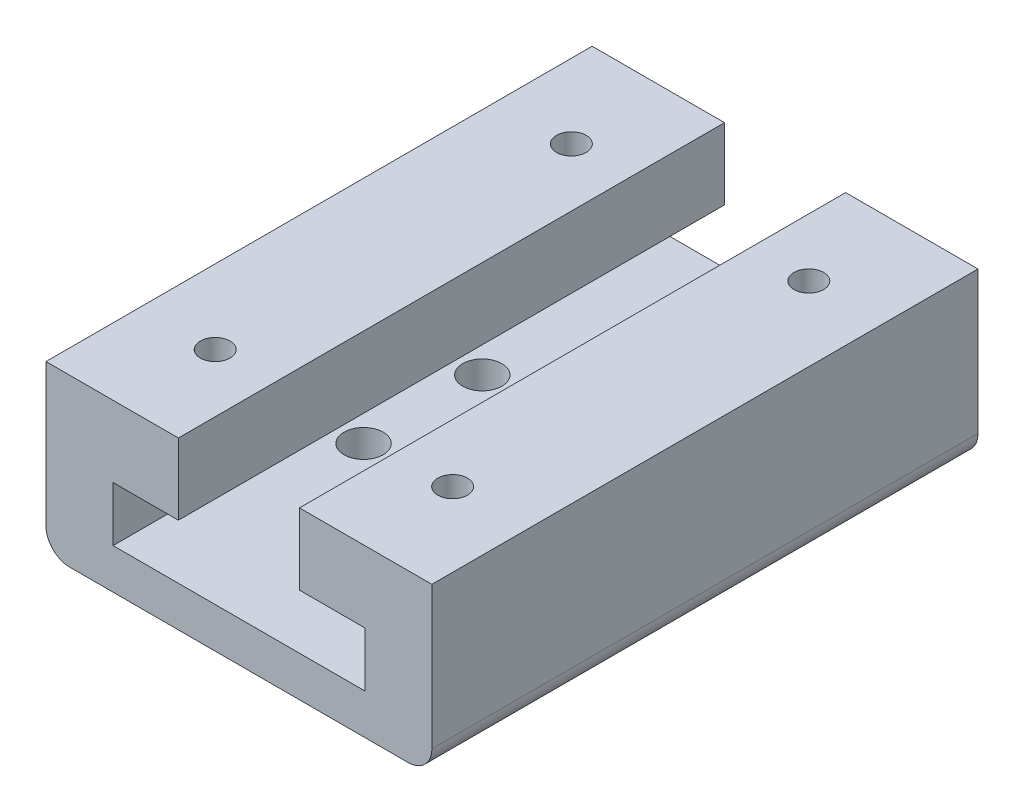
ISO-10303-21;
HEADER;
FILE_DESCRIPTION(('STEP AP214'),'2;1');
FILE_NAME('part.step','',(''),(''),'','','');
FILE_SCHEMA(('AUTOMOTIVE_DESIGN { 1 0 10303 214 1 1 1 1 }'));
ENDSEC;
DATA;
#1=APPLICATION_CONTEXT('core data for automotive mechanical design processes');
#2=APPLICATION_PROTOCOL_DEFINITION('international standard','automotive_design',2000,#1);
#3=PRODUCT_CONTEXT('',#1,'mechanical');
#4=PRODUCT('Part','Part','',(#3));
#5=PRODUCT_RELATED_PRODUCT_CATEGORY('part','',(#4));
#6=PRODUCT_DEFINITION_FORMATION('','',#4);
#7=PRODUCT_DEFINITION_CONTEXT('part definition',#1,'design');
#8=PRODUCT_DEFINITION('design','',#6,#7);
#9=PRODUCT_DEFINITION_SHAPE('','',#8);
#10=(LENGTH_UNIT() NAMED_UNIT(*) SI_UNIT(.MILLI.,.METRE.));
#11=(NAMED_UNIT(*) PLANE_ANGLE_UNIT() SI_UNIT($,.RADIAN.));
#12=(NAMED_UNIT(*) SI_UNIT($,.STERADIAN.) SOLID_ANGLE_UNIT());
#13=UNCERTAINTY_MEASURE_WITH_UNIT(LENGTH_MEASURE(1.E-05),#10,'distance_accuracy_value','');
#14=(GEOMETRIC_REPRESENTATION_CONTEXT(3) GLOBAL_UNCERTAINTY_ASSIGNED_CONTEXT((#13)) GLOBAL_UNIT_ASSIGNED_CONTEXT((#10,
#11,#12)) REPRESENTATION_CONTEXT('',''));
#15=CARTESIAN_POINT('',(0.,0.,0.));
#16=DIRECTION('',(0.,0.,1.));
#17=DIRECTION('',(1.,0.,0.));
#18=AXIS2_PLACEMENT_3D('',#15,#16,#17);
#19=CARTESIAN_POINT('',(16.25,14.,23.));
#20=DIRECTION('',(0.,0.,-1.));
#21=DIRECTION('',(-1.,0.,0.));
#22=AXIS2_PLACEMENT_3D('',#19,#20,#21);
#23=PLANE('',#22);
#24=DIRECTION('',(1.,0.,0.));
#25=VECTOR('',#24,1.);
#26=CARTESIAN_POINT('',(16.25,0.,23.));
#27=LINE('',#26,#25);
#28=CARTESIAN_POINT('',(-14.25,0.,23.));
#29=VERTEX_POINT('',#28);
#30=CARTESIAN_POINT('',(14.25,0.,23.));
#31=VERTEX_POINT('',#30);
#32=EDGE_CURVE('E198',#29,#31,#27,.T.);
#33=ORIENTED_EDGE('',*,*,#32,.T.);
#34=CARTESIAN_POINT('',(14.25,2.,23.));
#35=DIRECTION('',(0.,0.,-1.));
#36=DIRECTION('',(-1.,0.,0.));
#37=AXIS2_PLACEMENT_3D('',#34,#35,#36);
#38=CIRCLE('',#37,2.);
#39=CARTESIAN_POINT('',(16.25,2.,23.));
#40=VERTEX_POINT('',#39);
#41=EDGE_CURVE('E47',#31,#40,#38,.F.);
#42=ORIENTED_EDGE('',*,*,#41,.T.);
#43=DIRECTION('',(0.,-1.,0.));
#44=VECTOR('',#43,1.);
#45=CARTESIAN_POINT('',(16.25,14.,23.));
#46=LINE('',#45,#44);
#47=CARTESIAN_POINT('',(16.25,14.,23.));
#48=VERTEX_POINT('',#47);
#49=EDGE_CURVE('E233',#48,#40,#46,.T.);
#50=ORIENTED_EDGE('',*,*,#49,.F.);
#51=DIRECTION('',(1.,0.,0.));
#52=VECTOR('',#51,1.);
#53=CARTESIAN_POINT('',(16.25,14.,23.));
#54=LINE('',#53,#52);
#55=CARTESIAN_POINT('',(5.10000000000001,14.,23.));
#56=VERTEX_POINT('',#55);
#57=EDGE_CURVE('E166',#56,#48,#54,.T.);
#58=ORIENTED_EDGE('',*,*,#57,.F.);
#59=DIRECTION('',(0.,1.,0.));
#60=VECTOR('',#59,1.);
#61=CARTESIAN_POINT('',(5.10000000000001,0.,23.));
#62=LINE('',#61,#60);
#63=CARTESIAN_POINT('',(5.10000000000001,8.,23.));
#64=VERTEX_POINT('',#63);
#65=EDGE_CURVE('E153',#64,#56,#62,.T.);
#66=ORIENTED_EDGE('',*,*,#65,.F.);
#67=DIRECTION('',(-1.,0.,0.));
#68=VECTOR('',#67,1.);
#69=CARTESIAN_POINT('',(0.,8.,23.));
#70=LINE('',#69,#68);
#71=CARTESIAN_POINT('',(10.6,8.,23.));
#72=VERTEX_POINT('',#71);
#73=EDGE_CURVE('E142',#72,#64,#70,.T.);
#74=ORIENTED_EDGE('',*,*,#73,.F.);
#75=DIRECTION('',(0.,1.,0.));
#76=VECTOR('',#75,1.);
#77=CARTESIAN_POINT('',(10.6,0.,23.));
#78=LINE('',#77,#76);
#79=CARTESIAN_POINT('',(10.6,3.4,23.));
#80=VERTEX_POINT('',#79);
#81=EDGE_CURVE('E152',#80,#72,#78,.T.);
#82=ORIENTED_EDGE('',*,*,#81,.F.);
#83=DIRECTION('',(-1.,0.,0.));
#84=VECTOR('',#83,1.);
#85=CARTESIAN_POINT('',(0.,3.4,23.));
#86=LINE('',#85,#84);
#87=CARTESIAN_POINT('',(-10.6,3.4,23.));
#88=VERTEX_POINT('',#87);
#89=EDGE_CURVE('E176',#80,#88,#86,.T.);
#90=ORIENTED_EDGE('',*,*,#89,.T.);
#91=DIRECTION('',(0.,1.,0.));
#92=VECTOR('',#91,1.);
#93=CARTESIAN_POINT('',(-10.6,0.,23.));
#94=LINE('',#93,#92);
#95=CARTESIAN_POINT('',(-10.6,8.,23.));
#96=VERTEX_POINT('',#95);
#97=EDGE_CURVE('E179',#88,#96,#94,.T.);
#98=ORIENTED_EDGE('',*,*,#97,.T.);
#99=CARTESIAN_POINT('',(-5.09999999999999,8.,23.));
#100=VERTEX_POINT('',#99);
#101=EDGE_CURVE('E155',#100,#96,#70,.T.);
#102=ORIENTED_EDGE('',*,*,#101,.F.);
#103=DIRECTION('',(0.,1.,0.));
#104=VECTOR('',#103,1.);
#105=CARTESIAN_POINT('',(-5.09999999999999,0.,23.));
#106=LINE('',#105,#104);
#107=CARTESIAN_POINT('',(-5.09999999999999,14.,23.));
#108=VERTEX_POINT('',#107);
#109=EDGE_CURVE('E162',#100,#108,#106,.T.);
#110=ORIENTED_EDGE('',*,*,#109,.T.);
#111=CARTESIAN_POINT('',(-16.25,14.,23.));
#112=VERTEX_POINT('',#111);
#113=EDGE_CURVE('E215',#112,#108,#54,.T.);
#114=ORIENTED_EDGE('',*,*,#113,.F.);
#115=DIRECTION('',(0.,-1.,0.));
#116=VECTOR('',#115,1.);
#117=CARTESIAN_POINT('',(-16.25,14.,23.));
#118=LINE('',#117,#116);
#119=CARTESIAN_POINT('',(-16.25,2.,23.));
#120=VERTEX_POINT('',#119);
#121=EDGE_CURVE('E236',#112,#120,#118,.T.);
#122=ORIENTED_EDGE('',*,*,#121,.T.);
#123=CARTESIAN_POINT('',(-14.25,2.,23.));
#124=DIRECTION('',(0.,0.,-1.));
#125=DIRECTION('',(-1.,0.,0.));
#126=AXIS2_PLACEMENT_3D('',#123,#124,#125);
#127=CIRCLE('',#126,2.);
#128=EDGE_CURVE('E54',#120,#29,#127,.F.);
#129=ORIENTED_EDGE('',*,*,#128,.T.);
#130=EDGE_LOOP('',(#33,#42,#50,#58,#66,#74,#82,#90,#98,#102,#110,#114,#122,#129));
#131=FACE_BOUND('',#130,.T.);
#132=ADVANCED_FACE('F39',(#131),#23,.F.);
#133=CARTESIAN_POINT('',(16.25,14.,-23.));
#134=DIRECTION('',(0.,0.,1.));
#135=DIRECTION('',(1.,0.,0.));
#136=AXIS2_PLACEMENT_3D('',#133,#134,#135);
#137=PLANE('',#136);
#138=DIRECTION('',(0.,-1.,0.));
#139=VECTOR('',#138,1.);
#140=CARTESIAN_POINT('',(16.25,14.,-23.));
#141=LINE('',#140,#139);
#142=CARTESIAN_POINT('',(16.25,14.,-23.));
#143=VERTEX_POINT('',#142);
#144=CARTESIAN_POINT('',(16.25,2.,-23.));
#145=VERTEX_POINT('',#144);
#146=EDGE_CURVE('E230',#143,#145,#141,.T.);
#147=ORIENTED_EDGE('',*,*,#146,.T.);
#148=CARTESIAN_POINT('',(14.25,2.,-23.));
#149=DIRECTION('',(0.,0.,1.));
#150=DIRECTION('',(1.,0.,0.));
#151=AXIS2_PLACEMENT_3D('',#148,#149,#150);
#152=CIRCLE('',#151,2.);
#153=CARTESIAN_POINT('',(14.25,0.,-23.));
#154=VERTEX_POINT('',#153);
#155=EDGE_CURVE('E244',#145,#154,#152,.F.);
#156=ORIENTED_EDGE('',*,*,#155,.T.);
#157=DIRECTION('',(-1.,0.,0.));
#158=VECTOR('',#157,1.);
#159=CARTESIAN_POINT('',(16.25,0.,-23.));
#160=LINE('',#159,#158);
#161=CARTESIAN_POINT('',(-14.25,0.,-23.));
#162=VERTEX_POINT('',#161);
#163=EDGE_CURVE('E214',#154,#162,#160,.T.);
#164=ORIENTED_EDGE('',*,*,#163,.T.);
#165=CARTESIAN_POINT('',(-14.25,2.,-23.));
#166=DIRECTION('',(0.,0.,1.));
#167=DIRECTION('',(1.,0.,0.));
#168=AXIS2_PLACEMENT_3D('',#165,#166,#167);
#169=CIRCLE('',#168,2.);
#170=CARTESIAN_POINT('',(-16.25,2.,-23.));
#171=VERTEX_POINT('',#170);
#172=EDGE_CURVE('E242',#162,#171,#169,.F.);
#173=ORIENTED_EDGE('',*,*,#172,.T.);
#174=DIRECTION('',(0.,-1.,0.));
#175=VECTOR('',#174,1.);
#176=CARTESIAN_POINT('',(-16.25,14.,-23.));
#177=LINE('',#176,#175);
#178=CARTESIAN_POINT('',(-16.25,14.,-23.));
#179=VERTEX_POINT('',#178);
#180=EDGE_CURVE('E224',#179,#171,#177,.T.);
#181=ORIENTED_EDGE('',*,*,#180,.F.);
#182=DIRECTION('',(-1.,0.,0.));
#183=VECTOR('',#182,1.);
#184=CARTESIAN_POINT('',(16.25,14.,-23.));
#185=LINE('',#184,#183);
#186=CARTESIAN_POINT('',(-5.1,14.,-23.));
#187=VERTEX_POINT('',#186);
#188=EDGE_CURVE('E220',#187,#179,#185,.T.);
#189=ORIENTED_EDGE('',*,*,#188,.F.);
#190=DIRECTION('',(0.,1.,0.));
#191=VECTOR('',#190,1.);
#192=CARTESIAN_POINT('',(-5.1,0.,-23.));
#193=LINE('',#192,#191);
#194=CARTESIAN_POINT('',(-5.1,8.,-23.));
#195=VERTEX_POINT('',#194);
#196=EDGE_CURVE('E167',#195,#187,#193,.T.);
#197=ORIENTED_EDGE('',*,*,#196,.F.);
#198=DIRECTION('',(-1.,0.,0.));
#199=VECTOR('',#198,1.);
#200=CARTESIAN_POINT('',(0.,8.,-23.));
#201=LINE('',#200,#199);
#202=CARTESIAN_POINT('',(-10.6,8.,-23.));
#203=VERTEX_POINT('',#202);
#204=EDGE_CURVE('E169',#195,#203,#201,.T.);
#205=ORIENTED_EDGE('',*,*,#204,.T.);
#206=DIRECTION('',(0.,1.,0.));
#207=VECTOR('',#206,1.);
#208=CARTESIAN_POINT('',(-10.6,0.,-23.));
#209=LINE('',#208,#207);
#210=CARTESIAN_POINT('',(-10.6,3.4,-23.));
#211=VERTEX_POINT('',#210);
#212=EDGE_CURVE('E193',#211,#203,#209,.T.);
#213=ORIENTED_EDGE('',*,*,#212,.F.);
#214=DIRECTION('',(-1.,0.,0.));
#215=VECTOR('',#214,1.);
#216=CARTESIAN_POINT('',(0.,3.4,-23.));
#217=LINE('',#216,#215);
#218=CARTESIAN_POINT('',(10.6,3.4,-23.));
#219=VERTEX_POINT('',#218);
#220=EDGE_CURVE('E190',#219,#211,#217,.T.);
#221=ORIENTED_EDGE('',*,*,#220,.F.);
#222=DIRECTION('',(0.,1.,0.));
#223=VECTOR('',#222,1.);
#224=CARTESIAN_POINT('',(10.6,0.,-23.));
#225=LINE('',#224,#223);
#226=CARTESIAN_POINT('',(10.6,8.,-23.));
#227=VERTEX_POINT('',#226);
#228=EDGE_CURVE('E187',#219,#227,#225,.T.);
#229=ORIENTED_EDGE('',*,*,#228,.T.);
#230=CARTESIAN_POINT('',(5.1,8.,-23.));
#231=VERTEX_POINT('',#230);
#232=EDGE_CURVE('E185',#227,#231,#201,.T.);
#233=ORIENTED_EDGE('',*,*,#232,.T.);
#234=DIRECTION('',(0.,1.,0.));
#235=VECTOR('',#234,1.);
#236=CARTESIAN_POINT('',(5.1,0.,-23.));
#237=LINE('',#236,#235);
#238=CARTESIAN_POINT('',(5.1,14.,-23.));
#239=VERTEX_POINT('',#238);
#240=EDGE_CURVE('E160',#231,#239,#237,.T.);
#241=ORIENTED_EDGE('',*,*,#240,.T.);
#242=EDGE_CURVE('E221',#143,#239,#185,.T.);
#243=ORIENTED_EDGE('',*,*,#242,.F.);
#244=EDGE_LOOP('',(#147,#156,#164,#173,#181,#189,#197,#205,#213,#221,#229,#233,#241,#243));
#245=FACE_BOUND('',#244,.T.);
#246=ADVANCED_FACE('F258',(#245),#137,.F.);
#247=CARTESIAN_POINT('',(0.,14.,0.));
#248=DIRECTION('',(0.,1.,0.));
#249=DIRECTION('',(0.,0.,1.));
#250=AXIS2_PLACEMENT_3D('',#247,#248,#249);
#251=PLANE('',#250);
#252=CARTESIAN_POINT('',(10.,14.,15.));
#253=DIRECTION('',(0.,1.,0.));
#254=DIRECTION('',(0.,0.,1.));
#255=AXIS2_PLACEMENT_3D('',#252,#253,#254);
#256=CIRCLE('',#255,1.25);
#257=CARTESIAN_POINT('',(10.,14.,16.25));
#258=VERTEX_POINT('',#257);
#259=EDGE_CURVE('E426',#258,#258,#256,.T.);
#260=ORIENTED_EDGE('',*,*,#259,.F.);
#261=EDGE_LOOP('',(#260));
#262=FACE_BOUND('',#261,.T.);
#263=CARTESIAN_POINT('',(10.,14.,-15.));
#264=DIRECTION('',(0.,1.,0.));
#265=DIRECTION('',(0.,0.,1.));
#266=AXIS2_PLACEMENT_3D('',#263,#264,#265);
#267=CIRCLE('',#266,1.25);
#268=CARTESIAN_POINT('',(10.,14.,-13.75));
#269=VERTEX_POINT('',#268);
#270=EDGE_CURVE('E415',#269,#269,#267,.T.);
#271=ORIENTED_EDGE('',*,*,#270,.F.);
#272=EDGE_LOOP('',(#271));
#273=FACE_BOUND('',#272,.T.);
#274=ORIENTED_EDGE('',*,*,#242,.T.);
#275=DIRECTION('',(0.,0.,-1.));
#276=VECTOR('',#275,1.);
#277=CARTESIAN_POINT('',(5.10000000000001,14.,23.));
#278=LINE('',#277,#276);
#279=EDGE_CURVE('E196',#56,#239,#278,.T.);
#280=ORIENTED_EDGE('',*,*,#279,.F.);
#281=ORIENTED_EDGE('',*,*,#57,.T.);
#282=DIRECTION('',(0.,0.,-1.));
#283=VECTOR('',#282,1.);
#284=CARTESIAN_POINT('',(16.25,14.,23.));
#285=LINE('',#284,#283);
#286=EDGE_CURVE('E218',#48,#143,#285,.T.);
#287=ORIENTED_EDGE('',*,*,#286,.T.);
#288=EDGE_LOOP('',(#274,#280,#281,#287));
#289=FACE_BOUND('',#288,.T.);
#290=ADVANCED_FACE('F292',(#262,#273,#289),#251,.T.);
#291=CARTESIAN_POINT('',(-16.25,14.,23.));
#292=DIRECTION('',(1.,0.,0.));
#293=DIRECTION('',(0.,0.,-1.));
#294=AXIS2_PLACEMENT_3D('',#291,#292,#293);
#295=PLANE('',#294);
#296=ORIENTED_EDGE('',*,*,#180,.T.);
#297=DIRECTION('',(0.,0.,1.));
#298=VECTOR('',#297,1.);
#299=CARTESIAN_POINT('',(-16.25,2.,23.));
#300=LINE('',#299,#298);
#301=EDGE_CURVE('E11',#171,#120,#300,.T.);
#302=ORIENTED_EDGE('',*,*,#301,.T.);
#303=ORIENTED_EDGE('',*,*,#121,.F.);
#304=DIRECTION('',(0.,0.,1.));
#305=VECTOR('',#304,1.);
#306=CARTESIAN_POINT('',(-16.25,14.,23.));
#307=LINE('',#306,#305);
#308=EDGE_CURVE('E211',#179,#112,#307,.T.);
#309=ORIENTED_EDGE('',*,*,#308,.F.);
#310=EDGE_LOOP('',(#296,#302,#303,#309));
#311=FACE_BOUND('',#310,.T.);
#312=ADVANCED_FACE('F266',(#311),#295,.F.);
#313=CARTESIAN_POINT('',(16.25,14.,23.));
#314=DIRECTION('',(-1.,0.,0.));
#315=DIRECTION('',(0.,0.,1.));
#316=AXIS2_PLACEMENT_3D('',#313,#314,#315);
#317=PLANE('',#316);
#318=ORIENTED_EDGE('',*,*,#49,.T.);
#319=DIRECTION('',(0.,0.,-1.));
#320=VECTOR('',#319,1.);
#321=CARTESIAN_POINT('',(16.25,2.,23.));
#322=LINE('',#321,#320);
#323=EDGE_CURVE('E239',#40,#145,#322,.T.);
#324=ORIENTED_EDGE('',*,*,#323,.T.);
#325=ORIENTED_EDGE('',*,*,#146,.F.);
#326=ORIENTED_EDGE('',*,*,#286,.F.);
#327=EDGE_LOOP('',(#318,#324,#325,#326));
#328=FACE_BOUND('',#327,.T.);
#329=ADVANCED_FACE('F254',(#328),#317,.F.);
#330=CARTESIAN_POINT('',(-10.,14.,15.));
#331=DIRECTION('',(0.,1.,0.));
#332=DIRECTION('',(0.,0.,1.));
#333=AXIS2_PLACEMENT_3D('',#330,#331,#332);
#334=CIRCLE('',#333,1.25);
#335=CARTESIAN_POINT('',(-10.,14.,16.25));
#336=VERTEX_POINT('',#335);
#337=EDGE_CURVE('E421',#336,#336,#334,.T.);
#338=ORIENTED_EDGE('',*,*,#337,.F.);
#339=EDGE_LOOP('',(#338));
#340=FACE_BOUND('',#339,.T.);
#341=CARTESIAN_POINT('',(-10.,14.,-15.));
#342=DIRECTION('',(0.,1.,0.));
#343=DIRECTION('',(0.,0.,1.));
#344=AXIS2_PLACEMENT_3D('',#341,#342,#343);
#345=CIRCLE('',#344,1.25);
#346=CARTESIAN_POINT('',(-10.,14.,-13.75));
#347=VERTEX_POINT('',#346);
#348=EDGE_CURVE('E412',#347,#347,#345,.T.);
#349=ORIENTED_EDGE('',*,*,#348,.F.);
#350=EDGE_LOOP('',(#349));
#351=FACE_BOUND('',#350,.T.);
#352=DIRECTION('',(0.,0.,-1.));
#353=VECTOR('',#352,1.);
#354=CARTESIAN_POINT('',(-5.09999999999999,14.,23.));
#355=LINE('',#354,#353);
#356=EDGE_CURVE('E199',#108,#187,#355,.T.);
#357=ORIENTED_EDGE('',*,*,#356,.T.);
#358=ORIENTED_EDGE('',*,*,#188,.T.);
#359=ORIENTED_EDGE('',*,*,#308,.T.);
#360=ORIENTED_EDGE('',*,*,#113,.T.);
#361=EDGE_LOOP('',(#357,#358,#359,#360));
#362=FACE_BOUND('',#361,.T.);
#363=ADVANCED_FACE('F269',(#340,#351,#362),#251,.T.);
#364=CARTESIAN_POINT('',(0.,0.,0.));
#365=DIRECTION('',(0.,1.,0.));
#366=DIRECTION('',(0.,0.,1.));
#367=AXIS2_PLACEMENT_3D('',#364,#365,#366);
#368=PLANE('',#367);
#369=CARTESIAN_POINT('',(-7.5,0.,-5.));
#370=DIRECTION('',(0.,-1.,0.));
#371=DIRECTION('',(0.,0.,-1.));
#372=AXIS2_PLACEMENT_3D('',#369,#370,#371);
#373=CIRCLE('',#372,1.65);
#374=CARTESIAN_POINT('',(-7.5,0.,-6.65));
#375=VERTEX_POINT('',#374);
#376=EDGE_CURVE('E385',#375,#375,#373,.T.);
#377=ORIENTED_EDGE('',*,*,#376,.F.);
#378=EDGE_LOOP('',(#377));
#379=FACE_BOUND('',#378,.T.);
#380=CARTESIAN_POINT('',(7.5,0.,-5.));
#381=DIRECTION('',(0.,-1.,0.));
#382=DIRECTION('',(0.,0.,-1.));
#383=AXIS2_PLACEMENT_3D('',#380,#381,#382);
#384=CIRCLE('',#383,1.65);
#385=CARTESIAN_POINT('',(7.5,0.,-6.65));
#386=VERTEX_POINT('',#385);
#387=EDGE_CURVE('E389',#386,#386,#384,.T.);
#388=ORIENTED_EDGE('',*,*,#387,.F.);
#389=EDGE_LOOP('',(#388));
#390=FACE_BOUND('',#389,.T.);
#391=CARTESIAN_POINT('',(7.5,0.,5.));
#392=DIRECTION('',(0.,-1.,0.));
#393=DIRECTION('',(0.,0.,-1.));
#394=AXIS2_PLACEMENT_3D('',#391,#392,#393);
#395=CIRCLE('',#394,1.65);
#396=CARTESIAN_POINT('',(7.5,0.,3.35));
#397=VERTEX_POINT('',#396);
#398=EDGE_CURVE('E393',#397,#397,#395,.T.);
#399=ORIENTED_EDGE('',*,*,#398,.F.);
#400=EDGE_LOOP('',(#399));
#401=FACE_BOUND('',#400,.T.);
#402=CARTESIAN_POINT('',(-7.5,0.,5.));
#403=DIRECTION('',(0.,-1.,0.));
#404=DIRECTION('',(0.,0.,-1.));
#405=AXIS2_PLACEMENT_3D('',#402,#403,#404);
#406=CIRCLE('',#405,1.65);
#407=CARTESIAN_POINT('',(-7.5,0.,3.35));
#408=VERTEX_POINT('',#407);
#409=EDGE_CURVE('E396',#408,#408,#406,.T.);
#410=ORIENTED_EDGE('',*,*,#409,.F.);
#411=EDGE_LOOP('',(#410));
#412=FACE_BOUND('',#411,.T.);
#413=ORIENTED_EDGE('',*,*,#163,.F.);
#414=DIRECTION('',(0.,0.,-1.));
#415=VECTOR('',#414,1.);
#416=CARTESIAN_POINT('',(14.25,0.,0.));
#417=LINE('',#416,#415);
#418=EDGE_CURVE('E61',#154,#31,#417,.F.);
#419=ORIENTED_EDGE('',*,*,#418,.T.);
#420=ORIENTED_EDGE('',*,*,#32,.F.);
#421=DIRECTION('',(0.,0.,1.));
#422=VECTOR('',#421,1.);
#423=CARTESIAN_POINT('',(-14.25,0.,0.));
#424=LINE('',#423,#422);
#425=EDGE_CURVE('E246',#29,#162,#424,.F.);
#426=ORIENTED_EDGE('',*,*,#425,.T.);
#427=EDGE_LOOP('',(#413,#419,#420,#426));
#428=FACE_BOUND('',#427,.T.);
#429=ADVANCED_FACE('F261',(#379,#390,#401,#412,#428),#368,.F.);
#430=CARTESIAN_POINT('',(5.10000000000001,0.,23.));
#431=DIRECTION('',(-1.,0.,0.));
#432=DIRECTION('',(0.,0.,1.));
#433=AXIS2_PLACEMENT_3D('',#430,#431,#432);
#434=PLANE('',#433);
#435=ORIENTED_EDGE('',*,*,#240,.F.);
#436=DIRECTION('',(0.,0.,-1.));
#437=VECTOR('',#436,1.);
#438=CARTESIAN_POINT('',(5.10000000000001,8.,23.));
#439=LINE('',#438,#437);
#440=EDGE_CURVE('E146',#64,#231,#439,.T.);
#441=ORIENTED_EDGE('',*,*,#440,.F.);
#442=ORIENTED_EDGE('',*,*,#65,.T.);
#443=ORIENTED_EDGE('',*,*,#279,.T.);
#444=EDGE_LOOP('',(#435,#441,#442,#443));
#445=FACE_BOUND('',#444,.T.);
#446=ADVANCED_FACE('F157',(#445),#434,.T.);
#447=CARTESIAN_POINT('',(-5.09999999999999,0.,23.));
#448=DIRECTION('',(-1.,0.,0.));
#449=DIRECTION('',(0.,0.,1.));
#450=AXIS2_PLACEMENT_3D('',#447,#448,#449);
#451=PLANE('',#450);
#452=ORIENTED_EDGE('',*,*,#196,.T.);
#453=ORIENTED_EDGE('',*,*,#356,.F.);
#454=ORIENTED_EDGE('',*,*,#109,.F.);
#455=DIRECTION('',(0.,0.,-1.));
#456=VECTOR('',#455,1.);
#457=CARTESIAN_POINT('',(-5.09999999999999,8.,23.));
#458=LINE('',#457,#456);
#459=EDGE_CURVE('E202',#100,#195,#458,.T.);
#460=ORIENTED_EDGE('',*,*,#459,.T.);
#461=EDGE_LOOP('',(#452,#453,#454,#460));
#462=FACE_BOUND('',#461,.T.);
#463=ADVANCED_FACE('F275',(#462),#451,.F.);
#464=CARTESIAN_POINT('',(0.,8.,23.));
#465=DIRECTION('',(0.,-1.,0.));
#466=DIRECTION('',(0.,0.,-1.));
#467=AXIS2_PLACEMENT_3D('',#464,#465,#466);
#468=PLANE('',#467);
#469=ORIENTED_EDGE('',*,*,#204,.F.);
#470=ORIENTED_EDGE('',*,*,#459,.F.);
#471=ORIENTED_EDGE('',*,*,#101,.T.);
#472=DIRECTION('',(0.,0.,-1.));
#473=VECTOR('',#472,1.);
#474=CARTESIAN_POINT('',(-10.6,8.,23.));
#475=LINE('',#474,#473);
#476=EDGE_CURVE('E204',#96,#203,#475,.T.);
#477=ORIENTED_EDGE('',*,*,#476,.T.);
#478=EDGE_LOOP('',(#469,#470,#471,#477));
#479=FACE_BOUND('',#478,.T.);
#480=ADVANCED_FACE('F279',(#479),#468,.T.);
#481=CARTESIAN_POINT('',(-10.6,0.,23.));
#482=DIRECTION('',(-1.,0.,0.));
#483=DIRECTION('',(0.,0.,1.));
#484=AXIS2_PLACEMENT_3D('',#481,#482,#483);
#485=PLANE('',#484);
#486=ORIENTED_EDGE('',*,*,#212,.T.);
#487=ORIENTED_EDGE('',*,*,#476,.F.);
#488=ORIENTED_EDGE('',*,*,#97,.F.);
#489=DIRECTION('',(0.,0.,-1.));
#490=VECTOR('',#489,1.);
#491=CARTESIAN_POINT('',(-10.6,3.4,23.));
#492=LINE('',#491,#490);
#493=EDGE_CURVE('E206',#88,#211,#492,.T.);
#494=ORIENTED_EDGE('',*,*,#493,.T.);
#495=EDGE_LOOP('',(#486,#487,#488,#494));
#496=FACE_BOUND('',#495,.T.);
#497=ADVANCED_FACE('F283',(#496),#485,.F.);
#498=CARTESIAN_POINT('',(0.,3.4,23.));
#499=DIRECTION('',(0.,-1.,0.));
#500=DIRECTION('',(0.,0.,-1.));
#501=AXIS2_PLACEMENT_3D('',#498,#499,#500);
#502=PLANE('',#501);
#503=CARTESIAN_POINT('',(-7.5,3.4,-5.));
#504=DIRECTION('',(0.,-1.,0.));
#505=DIRECTION('',(0.,0.,-1.));
#506=AXIS2_PLACEMENT_3D('',#503,#504,#505);
#507=CIRCLE('',#506,1.65);
#508=CARTESIAN_POINT('',(-7.5,3.4,-6.65));
#509=VERTEX_POINT('',#508);
#510=EDGE_CURVE('E403',#509,#509,#507,.F.);
#511=ORIENTED_EDGE('',*,*,#510,.F.);
#512=EDGE_LOOP('',(#511));
#513=FACE_BOUND('',#512,.T.);
#514=CARTESIAN_POINT('',(7.5,3.4,-5.));
#515=DIRECTION('',(0.,-1.,0.));
#516=DIRECTION('',(0.,0.,-1.));
#517=AXIS2_PLACEMENT_3D('',#514,#515,#516);
#518=CIRCLE('',#517,1.65);
#519=CARTESIAN_POINT('',(7.5,3.4,-6.65));
#520=VERTEX_POINT('',#519);
#521=EDGE_CURVE('E402',#520,#520,#518,.F.);
#522=ORIENTED_EDGE('',*,*,#521,.F.);
#523=EDGE_LOOP('',(#522));
#524=FACE_BOUND('',#523,.T.);
#525=CARTESIAN_POINT('',(7.5,3.4,5.));
#526=DIRECTION('',(0.,-1.,0.));
#527=DIRECTION('',(0.,0.,-1.));
#528=AXIS2_PLACEMENT_3D('',#525,#526,#527);
#529=CIRCLE('',#528,1.65);
#530=CARTESIAN_POINT('',(7.5,3.4,3.35));
#531=VERTEX_POINT('',#530);
#532=EDGE_CURVE('E398',#531,#531,#529,.F.);
#533=ORIENTED_EDGE('',*,*,#532,.F.);
#534=EDGE_LOOP('',(#533));
#535=FACE_BOUND('',#534,.T.);
#536=CARTESIAN_POINT('',(-7.5,3.4,5.));
#537=DIRECTION('',(0.,-1.,0.));
#538=DIRECTION('',(0.,0.,-1.));
#539=AXIS2_PLACEMENT_3D('',#536,#537,#538);
#540=CIRCLE('',#539,1.65);
#541=CARTESIAN_POINT('',(-7.5,3.4,3.35));
#542=VERTEX_POINT('',#541);
#543=EDGE_CURVE('E172',#542,#542,#540,.F.);
#544=ORIENTED_EDGE('',*,*,#543,.F.);
#545=EDGE_LOOP('',(#544));
#546=FACE_BOUND('',#545,.T.);
#547=ORIENTED_EDGE('',*,*,#220,.T.);
#548=ORIENTED_EDGE('',*,*,#493,.F.);
#549=ORIENTED_EDGE('',*,*,#89,.F.);
#550=DIRECTION('',(0.,0.,-1.));
#551=VECTOR('',#550,1.);
#552=CARTESIAN_POINT('',(10.6,3.4,23.));
#553=LINE('',#552,#551);
#554=EDGE_CURVE('E208',#80,#219,#553,.T.);
#555=ORIENTED_EDGE('',*,*,#554,.T.);
#556=EDGE_LOOP('',(#547,#548,#549,#555));
#557=FACE_BOUND('',#556,.T.);
#558=ADVANCED_FACE('F287',(#513,#524,#535,#546,#557),#502,.F.);
#559=CARTESIAN_POINT('',(10.6,0.,23.));
#560=DIRECTION('',(-1.,0.,0.));
#561=DIRECTION('',(0.,0.,1.));
#562=AXIS2_PLACEMENT_3D('',#559,#560,#561);
#563=PLANE('',#562);
#564=ORIENTED_EDGE('',*,*,#228,.F.);
#565=ORIENTED_EDGE('',*,*,#554,.F.);
#566=ORIENTED_EDGE('',*,*,#81,.T.);
#567=DIRECTION('',(0.,0.,-1.));
#568=VECTOR('',#567,1.);
#569=CARTESIAN_POINT('',(10.6,8.,23.));
#570=LINE('',#569,#568);
#571=EDGE_CURVE('E148',#72,#227,#570,.T.);
#572=ORIENTED_EDGE('',*,*,#571,.T.);
#573=EDGE_LOOP('',(#564,#565,#566,#572));
#574=FACE_BOUND('',#573,.T.);
#575=ADVANCED_FACE('F290',(#574),#563,.T.);
#576=ORIENTED_EDGE('',*,*,#232,.F.);
#577=ORIENTED_EDGE('',*,*,#571,.F.);
#578=ORIENTED_EDGE('',*,*,#73,.T.);
#579=ORIENTED_EDGE('',*,*,#440,.T.);
#580=EDGE_LOOP('',(#576,#577,#578,#579));
#581=FACE_BOUND('',#580,.T.);
#582=ADVANCED_FACE('F145',(#581),#468,.T.);
#583=CARTESIAN_POINT('',(-7.5,14.001,5.));
#584=DIRECTION('',(0.,-1.,0.));
#585=DIRECTION('',(0.,0.,-1.));
#586=AXIS2_PLACEMENT_3D('',#583,#584,#585);
#587=CYLINDRICAL_SURFACE('',#586,1.65);
#588=CARTESIAN_POINT('',(-7.5,0.,3.35));
#589=CARTESIAN_POINT('',(-7.5,0.0354166666666685,3.35));
#590=CARTESIAN_POINT('',(-7.5,0.0708333333333354,3.35));
#591=CARTESIAN_POINT('',(-7.5,0.141666666666669,3.35));
#592=CARTESIAN_POINT('',(-7.5,0.177083333333336,3.35));
#593=CARTESIAN_POINT('',(-7.5,0.247916666666669,3.35));
#594=CARTESIAN_POINT('',(-7.5,0.283333333333335,3.35));
#595=CARTESIAN_POINT('',(-7.5,0.354166666666668,3.35));
#596=CARTESIAN_POINT('',(-7.5,0.389583333333335,3.35));
#597=CARTESIAN_POINT('',(-7.5,0.460416666666669,3.35));
#598=CARTESIAN_POINT('',(-7.5,0.495833333333335,3.35));
#599=CARTESIAN_POINT('',(-7.5,0.566666666666668,3.35));
#600=CARTESIAN_POINT('',(-7.5,0.602083333333335,3.35));
#601=CARTESIAN_POINT('',(-7.5,0.672916666666668,3.35));
#602=CARTESIAN_POINT('',(-7.5,0.708333333333335,3.35));
#603=CARTESIAN_POINT('',(-7.5,0.779166666666668,3.35));
#604=CARTESIAN_POINT('',(-7.5,0.814583333333335,3.35));
#605=CARTESIAN_POINT('',(-7.5,0.885416666666669,3.35));
#606=CARTESIAN_POINT('',(-7.5,0.920833333333336,3.35));
#607=CARTESIAN_POINT('',(-7.5,0.991666666666669,3.35));
#608=CARTESIAN_POINT('',(-7.5,1.02708333333334,3.35));
#609=CARTESIAN_POINT('',(-7.5,1.09791666666667,3.35));
#610=CARTESIAN_POINT('',(-7.5,1.13333333333334,3.35));
#611=CARTESIAN_POINT('',(-7.5,1.20416666666667,3.35));
#612=CARTESIAN_POINT('',(-7.5,1.23958333333334,3.35));
#613=CARTESIAN_POINT('',(-7.5,1.31041666666667,3.35));
#614=CARTESIAN_POINT('',(-7.5,1.34583333333334,3.35));
#615=CARTESIAN_POINT('',(-7.5,1.41666666666667,3.35));
#616=CARTESIAN_POINT('',(-7.5,1.45208333333333,3.35));
#617=CARTESIAN_POINT('',(-7.5,1.52291666666667,3.35));
#618=CARTESIAN_POINT('',(-7.5,1.55833333333333,3.35));
#619=CARTESIAN_POINT('',(-7.5,1.62916666666667,3.35));
#620=CARTESIAN_POINT('',(-7.5,1.66458333333334,3.35));
#621=CARTESIAN_POINT('',(-7.5,1.73541666666667,3.35));
#622=CARTESIAN_POINT('',(-7.5,1.77083333333334,3.35));
#623=CARTESIAN_POINT('',(-7.5,1.84166666666667,3.35));
#624=CARTESIAN_POINT('',(-7.5,1.87708333333334,3.35));
#625=CARTESIAN_POINT('',(-7.5,1.94791666666667,3.35));
#626=CARTESIAN_POINT('',(-7.5,1.98333333333334,3.35));
#627=CARTESIAN_POINT('',(-7.5,2.05416666666667,3.35));
#628=CARTESIAN_POINT('',(-7.5,2.08958333333334,3.35));
#629=CARTESIAN_POINT('',(-7.5,2.16041666666667,3.35));
#630=CARTESIAN_POINT('',(-7.5,2.19583333333334,3.35));
#631=CARTESIAN_POINT('',(-7.5,2.26666666666667,3.35));
#632=CARTESIAN_POINT('',(-7.5,2.30208333333333,3.35));
#633=CARTESIAN_POINT('',(-7.5,2.37291666666667,3.35));
#634=CARTESIAN_POINT('',(-7.5,2.40833333333333,3.35));
#635=CARTESIAN_POINT('',(-7.5,2.47916666666667,3.35));
#636=CARTESIAN_POINT('',(-7.5,2.51458333333334,3.35));
#637=CARTESIAN_POINT('',(-7.5,2.58541666666667,3.35));
#638=CARTESIAN_POINT('',(-7.5,2.62083333333334,3.35));
#639=CARTESIAN_POINT('',(-7.5,2.69166666666667,3.35));
#640=CARTESIAN_POINT('',(-7.5,2.72708333333334,3.35));
#641=CARTESIAN_POINT('',(-7.5,2.79791666666667,3.35));
#642=CARTESIAN_POINT('',(-7.5,2.83333333333334,3.35));
#643=CARTESIAN_POINT('',(-7.5,2.90416666666667,3.35));
#644=CARTESIAN_POINT('',(-7.5,2.93958333333334,3.35));
#645=CARTESIAN_POINT('',(-7.5,3.01041666666667,3.35));
#646=CARTESIAN_POINT('',(-7.5,3.04583333333334,3.35));
#647=CARTESIAN_POINT('',(-7.5,3.11666666666667,3.35));
#648=CARTESIAN_POINT('',(-7.5,3.15208333333333,3.35));
#649=CARTESIAN_POINT('',(-7.5,3.22291666666667,3.35));
#650=CARTESIAN_POINT('',(-7.5,3.25833333333334,3.35));
#651=CARTESIAN_POINT('',(-7.5,3.32916666666667,3.35));
#652=CARTESIAN_POINT('',(-7.5,3.36458333333334,3.35));
#653=CARTESIAN_POINT('',(-7.5,3.4,3.35));
#654=B_SPLINE_CURVE_WITH_KNOTS('',3,(#588,#589,#590,#591,#592,#593,#594,#595,#596,#597,#598,
#599,#600,#601,#602,#603,#604,#605,#606,#607,#608,#609,#610,#611,#612,#613,#614,#615,#616,#617,
#618,#619,#620,#621,#622,#623,#624,#625,#626,#627,#628,#629,#630,#631,#632,#633,#634,#635,#636,
#637,#638,#639,#640,#641,#642,#643,#644,#645,#646,#647,#648,#649,#650,#651,#652,#653),
.UNSPECIFIED.,.F.,.F.,(4,2,2,2,2,2,2,2,2,2,2,2,2,2,2,2,2,2,2,2,2,2,2,2,2,2,2,2,2,2,2,2,4),(0.,
0.10625,0.212500000000001,0.31875,0.425,0.53125,0.637499999999999,0.74375,0.85,0.95625,1.0625,
1.16875,1.275,1.38125,1.4875,1.59375,1.7,1.80625,1.9125,2.01875,2.125,2.23125,2.3375,2.44375,
2.55,2.65625,2.7625,2.86875,2.975,3.08125,3.1875,3.29375,3.4),.UNSPECIFIED.);
#655=EDGE_CURVE('BSEAM355',#408,#542,#654,.T.);
#656=ORIENTED_EDGE('',*,*,#409,.T.);
#657=ORIENTED_EDGE('',*,*,#543,.T.);
#658=ORIENTED_EDGE('',*,*,#655,.T.);
#659=ORIENTED_EDGE('',*,*,#655,.F.);
#660=EDGE_LOOP('',(#656,#658,#657,#659));
#661=FACE_BOUND('',#660,.T.);
#662=ADVANCED_FACE('F355',(#661),#587,.F.);
#663=CARTESIAN_POINT('',(7.5,14.001,5.));
#664=DIRECTION('',(0.,-1.,0.));
#665=DIRECTION('',(0.,0.,-1.));
#666=AXIS2_PLACEMENT_3D('',#663,#664,#665);
#667=CYLINDRICAL_SURFACE('',#666,1.65);
#668=CARTESIAN_POINT('',(7.5,0.,3.35));
#669=CARTESIAN_POINT('',(7.5,0.0354166666666685,3.35));
#670=CARTESIAN_POINT('',(7.5,0.0708333333333354,3.35));
#671=CARTESIAN_POINT('',(7.5,0.141666666666669,3.35));
#672=CARTESIAN_POINT('',(7.5,0.177083333333336,3.35));
#673=CARTESIAN_POINT('',(7.5,0.247916666666669,3.35));
#674=CARTESIAN_POINT('',(7.5,0.283333333333335,3.35));
#675=CARTESIAN_POINT('',(7.5,0.354166666666668,3.35));
#676=CARTESIAN_POINT('',(7.5,0.389583333333335,3.35));
#677=CARTESIAN_POINT('',(7.5,0.460416666666669,3.35));
#678=CARTESIAN_POINT('',(7.5,0.495833333333335,3.35));
#679=CARTESIAN_POINT('',(7.5,0.566666666666668,3.35));
#680=CARTESIAN_POINT('',(7.5,0.602083333333335,3.35));
#681=CARTESIAN_POINT('',(7.5,0.672916666666668,3.35));
#682=CARTESIAN_POINT('',(7.5,0.708333333333335,3.35));
#683=CARTESIAN_POINT('',(7.5,0.779166666666668,3.35));
#684=CARTESIAN_POINT('',(7.5,0.814583333333335,3.35));
#685=CARTESIAN_POINT('',(7.5,0.885416666666669,3.35));
#686=CARTESIAN_POINT('',(7.5,0.920833333333336,3.35));
#687=CARTESIAN_POINT('',(7.5,0.991666666666669,3.35));
#688=CARTESIAN_POINT('',(7.5,1.02708333333334,3.35));
#689=CARTESIAN_POINT('',(7.5,1.09791666666667,3.35));
#690=CARTESIAN_POINT('',(7.5,1.13333333333334,3.35));
#691=CARTESIAN_POINT('',(7.5,1.20416666666667,3.35));
#692=CARTESIAN_POINT('',(7.5,1.23958333333334,3.35));
#693=CARTESIAN_POINT('',(7.5,1.31041666666667,3.35));
#694=CARTESIAN_POINT('',(7.5,1.34583333333334,3.35));
#695=CARTESIAN_POINT('',(7.5,1.41666666666667,3.35));
#696=CARTESIAN_POINT('',(7.5,1.45208333333333,3.35));
#697=CARTESIAN_POINT('',(7.5,1.52291666666667,3.35));
#698=CARTESIAN_POINT('',(7.5,1.55833333333333,3.35));
#699=CARTESIAN_POINT('',(7.5,1.62916666666667,3.35));
#700=CARTESIAN_POINT('',(7.5,1.66458333333334,3.35));
#701=CARTESIAN_POINT('',(7.5,1.73541666666667,3.35));
#702=CARTESIAN_POINT('',(7.5,1.77083333333334,3.35));
#703=CARTESIAN_POINT('',(7.5,1.84166666666667,3.35));
#704=CARTESIAN_POINT('',(7.5,1.87708333333334,3.35));
#705=CARTESIAN_POINT('',(7.5,1.94791666666667,3.35));
#706=CARTESIAN_POINT('',(7.5,1.98333333333334,3.35));
#707=CARTESIAN_POINT('',(7.5,2.05416666666667,3.35));
#708=CARTESIAN_POINT('',(7.5,2.08958333333334,3.35));
#709=CARTESIAN_POINT('',(7.5,2.16041666666667,3.35));
#710=CARTESIAN_POINT('',(7.5,2.19583333333334,3.35));
#711=CARTESIAN_POINT('',(7.5,2.26666666666667,3.35));
#712=CARTESIAN_POINT('',(7.5,2.30208333333333,3.35));
#713=CARTESIAN_POINT('',(7.5,2.37291666666667,3.35));
#714=CARTESIAN_POINT('',(7.5,2.40833333333333,3.35));
#715=CARTESIAN_POINT('',(7.5,2.47916666666667,3.35));
#716=CARTESIAN_POINT('',(7.5,2.51458333333334,3.35));
#717=CARTESIAN_POINT('',(7.5,2.58541666666667,3.35));
#718=CARTESIAN_POINT('',(7.5,2.62083333333334,3.35));
#719=CARTESIAN_POINT('',(7.5,2.69166666666667,3.35));
#720=CARTESIAN_POINT('',(7.5,2.72708333333334,3.35));
#721=CARTESIAN_POINT('',(7.5,2.79791666666667,3.35));
#722=CARTESIAN_POINT('',(7.5,2.83333333333334,3.35));
#723=CARTESIAN_POINT('',(7.5,2.90416666666667,3.35));
#724=CARTESIAN_POINT('',(7.5,2.93958333333334,3.35));
#725=CARTESIAN_POINT('',(7.5,3.01041666666667,3.35));
#726=CARTESIAN_POINT('',(7.5,3.04583333333334,3.35));
#727=CARTESIAN_POINT('',(7.5,3.11666666666667,3.35));
#728=CARTESIAN_POINT('',(7.5,3.15208333333333,3.35));
#729=CARTESIAN_POINT('',(7.5,3.22291666666667,3.35));
#730=CARTESIAN_POINT('',(7.5,3.25833333333334,3.35));
#731=CARTESIAN_POINT('',(7.5,3.32916666666667,3.35));
#732=CARTESIAN_POINT('',(7.5,3.36458333333334,3.35));
#733=CARTESIAN_POINT('',(7.5,3.4,3.35));
#734=B_SPLINE_CURVE_WITH_KNOTS('',3,(#668,#669,#670,#671,#672,#673,#674,#675,#676,#677,#678,
#679,#680,#681,#682,#683,#684,#685,#686,#687,#688,#689,#690,#691,#692,#693,#694,#695,#696,#697,
#698,#699,#700,#701,#702,#703,#704,#705,#706,#707,#708,#709,#710,#711,#712,#713,#714,#715,#716,
#717,#718,#719,#720,#721,#722,#723,#724,#725,#726,#727,#728,#729,#730,#731,#732,#733),
.UNSPECIFIED.,.F.,.F.,(4,2,2,2,2,2,2,2,2,2,2,2,2,2,2,2,2,2,2,2,2,2,2,2,2,2,2,2,2,2,2,2,4),(0.,
0.10625,0.212500000000001,0.31875,0.425,0.53125,0.637499999999999,0.74375,0.85,0.95625,1.0625,
1.16875,1.275,1.38125,1.4875,1.59375,1.7,1.80625,1.9125,2.01875,2.125,2.23125,2.3375,2.44375,
2.55,2.65625,2.7625,2.86875,2.975,3.08125,3.1875,3.29375,3.4),.UNSPECIFIED.);
#735=EDGE_CURVE('BSEAM351',#397,#531,#734,.T.);
#736=ORIENTED_EDGE('',*,*,#398,.T.);
#737=ORIENTED_EDGE('',*,*,#532,.T.);
#738=ORIENTED_EDGE('',*,*,#735,.T.);
#739=ORIENTED_EDGE('',*,*,#735,.F.);
#740=EDGE_LOOP('',(#736,#738,#737,#739));
#741=FACE_BOUND('',#740,.T.);
#742=ADVANCED_FACE('F351',(#741),#667,.F.);
#743=CARTESIAN_POINT('',(7.5,14.001,-5.));
#744=DIRECTION('',(0.,-1.,0.));
#745=DIRECTION('',(0.,0.,-1.));
#746=AXIS2_PLACEMENT_3D('',#743,#744,#745);
#747=CYLINDRICAL_SURFACE('',#746,1.65);
#748=CARTESIAN_POINT('',(7.5,0.,-6.65));
#749=CARTESIAN_POINT('',(7.5,0.0354166666666685,-6.65));
#750=CARTESIAN_POINT('',(7.5,0.0708333333333354,-6.65));
#751=CARTESIAN_POINT('',(7.5,0.141666666666669,-6.65));
#752=CARTESIAN_POINT('',(7.5,0.177083333333336,-6.65));
#753=CARTESIAN_POINT('',(7.5,0.247916666666669,-6.65));
#754=CARTESIAN_POINT('',(7.5,0.283333333333335,-6.65));
#755=CARTESIAN_POINT('',(7.5,0.354166666666668,-6.65));
#756=CARTESIAN_POINT('',(7.5,0.389583333333335,-6.65));
#757=CARTESIAN_POINT('',(7.5,0.460416666666669,-6.65));
#758=CARTESIAN_POINT('',(7.5,0.495833333333335,-6.65));
#759=CARTESIAN_POINT('',(7.5,0.566666666666668,-6.65));
#760=CARTESIAN_POINT('',(7.5,0.602083333333335,-6.65));
#761=CARTESIAN_POINT('',(7.5,0.672916666666668,-6.65));
#762=CARTESIAN_POINT('',(7.5,0.708333333333335,-6.65));
#763=CARTESIAN_POINT('',(7.5,0.779166666666668,-6.65));
#764=CARTESIAN_POINT('',(7.5,0.814583333333335,-6.65));
#765=CARTESIAN_POINT('',(7.5,0.885416666666669,-6.65));
#766=CARTESIAN_POINT('',(7.5,0.920833333333336,-6.65));
#767=CARTESIAN_POINT('',(7.5,0.991666666666669,-6.65));
#768=CARTESIAN_POINT('',(7.5,1.02708333333334,-6.65));
#769=CARTESIAN_POINT('',(7.5,1.09791666666667,-6.65));
#770=CARTESIAN_POINT('',(7.5,1.13333333333334,-6.65));
#771=CARTESIAN_POINT('',(7.5,1.20416666666667,-6.65));
#772=CARTESIAN_POINT('',(7.5,1.23958333333334,-6.65));
#773=CARTESIAN_POINT('',(7.5,1.31041666666667,-6.65));
#774=CARTESIAN_POINT('',(7.5,1.34583333333334,-6.65));
#775=CARTESIAN_POINT('',(7.5,1.41666666666667,-6.65));
#776=CARTESIAN_POINT('',(7.5,1.45208333333333,-6.65));
#777=CARTESIAN_POINT('',(7.5,1.52291666666667,-6.65));
#778=CARTESIAN_POINT('',(7.5,1.55833333333333,-6.65));
#779=CARTESIAN_POINT('',(7.5,1.62916666666667,-6.65));
#780=CARTESIAN_POINT('',(7.5,1.66458333333334,-6.65));
#781=CARTESIAN_POINT('',(7.5,1.73541666666667,-6.65));
#782=CARTESIAN_POINT('',(7.5,1.77083333333334,-6.65));
#783=CARTESIAN_POINT('',(7.5,1.84166666666667,-6.65));
#784=CARTESIAN_POINT('',(7.5,1.87708333333334,-6.65));
#785=CARTESIAN_POINT('',(7.5,1.94791666666667,-6.65));
#786=CARTESIAN_POINT('',(7.5,1.98333333333334,-6.65));
#787=CARTESIAN_POINT('',(7.5,2.05416666666667,-6.65));
#788=CARTESIAN_POINT('',(7.5,2.08958333333334,-6.65));
#789=CARTESIAN_POINT('',(7.5,2.16041666666667,-6.65));
#790=CARTESIAN_POINT('',(7.5,2.19583333333334,-6.65));
#791=CARTESIAN_POINT('',(7.5,2.26666666666667,-6.65));
#792=CARTESIAN_POINT('',(7.5,2.30208333333333,-6.65));
#793=CARTESIAN_POINT('',(7.5,2.37291666666667,-6.65));
#794=CARTESIAN_POINT('',(7.5,2.40833333333333,-6.65));
#795=CARTESIAN_POINT('',(7.5,2.47916666666667,-6.65));
#796=CARTESIAN_POINT('',(7.5,2.51458333333334,-6.65));
#797=CARTESIAN_POINT('',(7.5,2.58541666666667,-6.65));
#798=CARTESIAN_POINT('',(7.5,2.62083333333334,-6.65));
#799=CARTESIAN_POINT('',(7.5,2.69166666666667,-6.65));
#800=CARTESIAN_POINT('',(7.5,2.72708333333334,-6.65));
#801=CARTESIAN_POINT('',(7.5,2.79791666666667,-6.65));
#802=CARTESIAN_POINT('',(7.5,2.83333333333334,-6.65));
#803=CARTESIAN_POINT('',(7.5,2.90416666666667,-6.65));
#804=CARTESIAN_POINT('',(7.5,2.93958333333334,-6.65));
#805=CARTESIAN_POINT('',(7.5,3.01041666666667,-6.65));
#806=CARTESIAN_POINT('',(7.5,3.04583333333334,-6.65));
#807=CARTESIAN_POINT('',(7.5,3.11666666666667,-6.65));
#808=CARTESIAN_POINT('',(7.5,3.15208333333333,-6.65));
#809=CARTESIAN_POINT('',(7.5,3.22291666666667,-6.65));
#810=CARTESIAN_POINT('',(7.5,3.25833333333334,-6.65));
#811=CARTESIAN_POINT('',(7.5,3.32916666666667,-6.65));
#812=CARTESIAN_POINT('',(7.5,3.36458333333334,-6.65));
#813=CARTESIAN_POINT('',(7.5,3.4,-6.65));
#814=B_SPLINE_CURVE_WITH_KNOTS('',3,(#748,#749,#750,#751,#752,#753,#754,#755,#756,#757,#758,
#759,#760,#761,#762,#763,#764,#765,#766,#767,#768,#769,#770,#771,#772,#773,#774,#775,#776,#777,
#778,#779,#780,#781,#782,#783,#784,#785,#786,#787,#788,#789,#790,#791,#792,#793,#794,#795,#796,
#797,#798,#799,#800,#801,#802,#803,#804,#805,#806,#807,#808,#809,#810,#811,#812,#813),
.UNSPECIFIED.,.F.,.F.,(4,2,2,2,2,2,2,2,2,2,2,2,2,2,2,2,2,2,2,2,2,2,2,2,2,2,2,2,2,2,2,2,4),(0.,
0.10625,0.212500000000001,0.31875,0.425,0.53125,0.637499999999999,0.74375,0.85,0.95625,1.0625,
1.16875,1.275,1.38125,1.4875,1.59375,1.7,1.80625,1.9125,2.01875,2.125,2.23125,2.3375,2.44375,
2.55,2.65625,2.7625,2.86875,2.975,3.08125,3.1875,3.29375,3.4),.UNSPECIFIED.);
#815=EDGE_CURVE('BSEAM354',#386,#520,#814,.T.);
#816=ORIENTED_EDGE('',*,*,#387,.T.);
#817=ORIENTED_EDGE('',*,*,#521,.T.);
#818=ORIENTED_EDGE('',*,*,#815,.T.);
#819=ORIENTED_EDGE('',*,*,#815,.F.);
#820=EDGE_LOOP('',(#816,#818,#817,#819));
#821=FACE_BOUND('',#820,.T.);
#822=ADVANCED_FACE('F354',(#821),#747,.F.);
#823=CARTESIAN_POINT('',(-7.5,14.001,-5.));
#824=DIRECTION('',(0.,-1.,0.));
#825=DIRECTION('',(0.,0.,-1.));
#826=AXIS2_PLACEMENT_3D('',#823,#824,#825);
#827=CYLINDRICAL_SURFACE('',#826,1.65);
#828=CARTESIAN_POINT('',(-7.5,0.,-6.65));
#829=CARTESIAN_POINT('',(-7.5,0.0354166666666685,-6.65));
#830=CARTESIAN_POINT('',(-7.5,0.0708333333333354,-6.65));
#831=CARTESIAN_POINT('',(-7.5,0.141666666666669,-6.65));
#832=CARTESIAN_POINT('',(-7.5,0.177083333333336,-6.65));
#833=CARTESIAN_POINT('',(-7.5,0.247916666666669,-6.65));
#834=CARTESIAN_POINT('',(-7.5,0.283333333333335,-6.65));
#835=CARTESIAN_POINT('',(-7.5,0.354166666666668,-6.65));
#836=CARTESIAN_POINT('',(-7.5,0.389583333333335,-6.65));
#837=CARTESIAN_POINT('',(-7.5,0.460416666666669,-6.65));
#838=CARTESIAN_POINT('',(-7.5,0.495833333333335,-6.65));
#839=CARTESIAN_POINT('',(-7.5,0.566666666666668,-6.65));
#840=CARTESIAN_POINT('',(-7.5,0.602083333333335,-6.65));
#841=CARTESIAN_POINT('',(-7.5,0.672916666666668,-6.65));
#842=CARTESIAN_POINT('',(-7.5,0.708333333333335,-6.65));
#843=CARTESIAN_POINT('',(-7.5,0.779166666666668,-6.65));
#844=CARTESIAN_POINT('',(-7.5,0.814583333333335,-6.65));
#845=CARTESIAN_POINT('',(-7.5,0.885416666666669,-6.65));
#846=CARTESIAN_POINT('',(-7.5,0.920833333333336,-6.65));
#847=CARTESIAN_POINT('',(-7.5,0.991666666666669,-6.65));
#848=CARTESIAN_POINT('',(-7.5,1.02708333333334,-6.65));
#849=CARTESIAN_POINT('',(-7.5,1.09791666666667,-6.65));
#850=CARTESIAN_POINT('',(-7.5,1.13333333333334,-6.65));
#851=CARTESIAN_POINT('',(-7.5,1.20416666666667,-6.65));
#852=CARTESIAN_POINT('',(-7.5,1.23958333333334,-6.65));
#853=CARTESIAN_POINT('',(-7.5,1.31041666666667,-6.65));
#854=CARTESIAN_POINT('',(-7.5,1.34583333333334,-6.65));
#855=CARTESIAN_POINT('',(-7.5,1.41666666666667,-6.65));
#856=CARTESIAN_POINT('',(-7.5,1.45208333333333,-6.65));
#857=CARTESIAN_POINT('',(-7.5,1.52291666666667,-6.65));
#858=CARTESIAN_POINT('',(-7.5,1.55833333333333,-6.65));
#859=CARTESIAN_POINT('',(-7.5,1.62916666666667,-6.65));
#860=CARTESIAN_POINT('',(-7.5,1.66458333333334,-6.65));
#861=CARTESIAN_POINT('',(-7.5,1.73541666666667,-6.65));
#862=CARTESIAN_POINT('',(-7.5,1.77083333333334,-6.65));
#863=CARTESIAN_POINT('',(-7.5,1.84166666666667,-6.65));
#864=CARTESIAN_POINT('',(-7.5,1.87708333333334,-6.65));
#865=CARTESIAN_POINT('',(-7.5,1.94791666666667,-6.65));
#866=CARTESIAN_POINT('',(-7.5,1.98333333333334,-6.65));
#867=CARTESIAN_POINT('',(-7.5,2.05416666666667,-6.65));
#868=CARTESIAN_POINT('',(-7.5,2.08958333333334,-6.65));
#869=CARTESIAN_POINT('',(-7.5,2.16041666666667,-6.65));
#870=CARTESIAN_POINT('',(-7.5,2.19583333333334,-6.65));
#871=CARTESIAN_POINT('',(-7.5,2.26666666666667,-6.65));
#872=CARTESIAN_POINT('',(-7.5,2.30208333333333,-6.65));
#873=CARTESIAN_POINT('',(-7.5,2.37291666666667,-6.65));
#874=CARTESIAN_POINT('',(-7.5,2.40833333333333,-6.65));
#875=CARTESIAN_POINT('',(-7.5,2.47916666666667,-6.65));
#876=CARTESIAN_POINT('',(-7.5,2.51458333333334,-6.65));
#877=CARTESIAN_POINT('',(-7.5,2.58541666666667,-6.65));
#878=CARTESIAN_POINT('',(-7.5,2.62083333333334,-6.65));
#879=CARTESIAN_POINT('',(-7.5,2.69166666666667,-6.65));
#880=CARTESIAN_POINT('',(-7.5,2.72708333333334,-6.65));
#881=CARTESIAN_POINT('',(-7.5,2.79791666666667,-6.65));
#882=CARTESIAN_POINT('',(-7.5,2.83333333333334,-6.65));
#883=CARTESIAN_POINT('',(-7.5,2.90416666666667,-6.65));
#884=CARTESIAN_POINT('',(-7.5,2.93958333333334,-6.65));
#885=CARTESIAN_POINT('',(-7.5,3.01041666666667,-6.65));
#886=CARTESIAN_POINT('',(-7.5,3.04583333333334,-6.65));
#887=CARTESIAN_POINT('',(-7.5,3.11666666666667,-6.65));
#888=CARTESIAN_POINT('',(-7.5,3.15208333333333,-6.65));
#889=CARTESIAN_POINT('',(-7.5,3.22291666666667,-6.65));
#890=CARTESIAN_POINT('',(-7.5,3.25833333333334,-6.65));
#891=CARTESIAN_POINT('',(-7.5,3.32916666666667,-6.65));
#892=CARTESIAN_POINT('',(-7.5,3.36458333333334,-6.65));
#893=CARTESIAN_POINT('',(-7.5,3.4,-6.65));
#894=B_SPLINE_CURVE_WITH_KNOTS('',3,(#828,#829,#830,#831,#832,#833,#834,#835,#836,#837,#838,
#839,#840,#841,#842,#843,#844,#845,#846,#847,#848,#849,#850,#851,#852,#853,#854,#855,#856,#857,
#858,#859,#860,#861,#862,#863,#864,#865,#866,#867,#868,#869,#870,#871,#872,#873,#874,#875,#876,
#877,#878,#879,#880,#881,#882,#883,#884,#885,#886,#887,#888,#889,#890,#891,#892,#893),
.UNSPECIFIED.,.F.,.F.,(4,2,2,2,2,2,2,2,2,2,2,2,2,2,2,2,2,2,2,2,2,2,2,2,2,2,2,2,2,2,2,2,4),(0.,
0.10625,0.212500000000001,0.31875,0.425,0.53125,0.637499999999999,0.74375,0.85,0.95625,1.0625,
1.16875,1.275,1.38125,1.4875,1.59375,1.7,1.80625,1.9125,2.01875,2.125,2.23125,2.3375,2.44375,
2.55,2.65625,2.7625,2.86875,2.975,3.08125,3.1875,3.29375,3.4),.UNSPECIFIED.);
#895=EDGE_CURVE('BSEAM349',#375,#509,#894,.T.);
#896=ORIENTED_EDGE('',*,*,#376,.T.);
#897=ORIENTED_EDGE('',*,*,#510,.T.);
#898=ORIENTED_EDGE('',*,*,#895,.T.);
#899=ORIENTED_EDGE('',*,*,#895,.F.);
#900=EDGE_LOOP('',(#896,#898,#897,#899));
#901=FACE_BOUND('',#900,.T.);
#902=ADVANCED_FACE('F349',(#901),#827,.F.);
#903=CARTESIAN_POINT('',(-10.,12.,-15.));
#904=DIRECTION('',(0.,1.,0.));
#905=DIRECTION('',(0.,0.,1.));
#906=AXIS2_PLACEMENT_3D('',#903,#904,#905);
#907=CYLINDRICAL_SURFACE('',#906,1.25);
#908=CARTESIAN_POINT('',(-10.,12.,-15.));
#909=DIRECTION('',(0.,1.,0.));
#910=DIRECTION('',(0.,0.,1.));
#911=AXIS2_PLACEMENT_3D('',#908,#909,#910);
#912=CIRCLE('',#911,1.25);
#913=CARTESIAN_POINT('',(-10.,12.,-13.75));
#914=VERTEX_POINT('',#913);
#915=EDGE_CURVE('E406',#914,#914,#912,.T.);
#916=ORIENTED_EDGE('',*,*,#915,.F.);
#917=EDGE_LOOP('',(#916));
#918=FACE_BOUND('',#917,.T.);
#919=ORIENTED_EDGE('',*,*,#348,.T.);
#920=EDGE_LOOP('',(#919));
#921=FACE_BOUND('',#920,.T.);
#922=ADVANCED_FACE('F345',(#918,#921),#907,.F.);
#923=CARTESIAN_POINT('',(-10.,12.,-15.));
#924=DIRECTION('',(0.,1.,0.));
#925=DIRECTION('',(0.,0.,1.));
#926=AXIS2_PLACEMENT_3D('',#923,#924,#925);
#927=PLANE('',#926);
#928=ORIENTED_EDGE('',*,*,#915,.T.);
#929=EDGE_LOOP('',(#928));
#930=FACE_BOUND('',#929,.T.);
#931=ADVANCED_FACE('F337',(#930),#927,.T.);
#932=CARTESIAN_POINT('',(-10.,12.,15.));
#933=DIRECTION('',(0.,1.,0.));
#934=DIRECTION('',(0.,0.,1.));
#935=AXIS2_PLACEMENT_3D('',#932,#933,#934);
#936=CYLINDRICAL_SURFACE('',#935,1.25);
#937=CARTESIAN_POINT('',(-10.,12.,15.));
#938=DIRECTION('',(0.,1.,0.));
#939=DIRECTION('',(0.,0.,1.));
#940=AXIS2_PLACEMENT_3D('',#937,#938,#939);
#941=CIRCLE('',#940,1.25);
#942=CARTESIAN_POINT('',(-10.,12.,16.25));
#943=VERTEX_POINT('',#942);
#944=EDGE_CURVE('E418',#943,#943,#941,.T.);
#945=ORIENTED_EDGE('',*,*,#944,.F.);
#946=EDGE_LOOP('',(#945));
#947=FACE_BOUND('',#946,.T.);
#948=ORIENTED_EDGE('',*,*,#337,.T.);
#949=EDGE_LOOP('',(#948));
#950=FACE_BOUND('',#949,.T.);
#951=ADVANCED_FACE('F333',(#947,#950),#936,.F.);
#952=CARTESIAN_POINT('',(-10.,12.,15.));
#953=DIRECTION('',(0.,1.,0.));
#954=DIRECTION('',(0.,0.,1.));
#955=AXIS2_PLACEMENT_3D('',#952,#953,#954);
#956=PLANE('',#955);
#957=ORIENTED_EDGE('',*,*,#944,.T.);
#958=EDGE_LOOP('',(#957));
#959=FACE_BOUND('',#958,.T.);
#960=ADVANCED_FACE('F336',(#959),#956,.T.);
#961=CARTESIAN_POINT('',(10.,12.,-15.));
#962=DIRECTION('',(0.,1.,0.));
#963=DIRECTION('',(0.,0.,1.));
#964=AXIS2_PLACEMENT_3D('',#961,#962,#963);
#965=CYLINDRICAL_SURFACE('',#964,1.25);
#966=CARTESIAN_POINT('',(10.,12.,-15.));
#967=DIRECTION('',(0.,1.,0.));
#968=DIRECTION('',(0.,0.,1.));
#969=AXIS2_PLACEMENT_3D('',#966,#967,#968);
#970=CIRCLE('',#969,1.25);
#971=CARTESIAN_POINT('',(10.,12.,-13.75));
#972=VERTEX_POINT('',#971);
#973=EDGE_CURVE('E429',#972,#972,#970,.T.);
#974=ORIENTED_EDGE('',*,*,#973,.F.);
#975=EDGE_LOOP('',(#974));
#976=FACE_BOUND('',#975,.T.);
#977=ORIENTED_EDGE('',*,*,#270,.T.);
#978=EDGE_LOOP('',(#977));
#979=FACE_BOUND('',#978,.T.);
#980=ADVANCED_FACE('F341',(#976,#979),#965,.F.);
#981=CARTESIAN_POINT('',(10.,12.,-15.));
#982=DIRECTION('',(0.,1.,0.));
#983=DIRECTION('',(0.,0.,1.));
#984=AXIS2_PLACEMENT_3D('',#981,#982,#983);
#985=PLANE('',#984);
#986=ORIENTED_EDGE('',*,*,#973,.T.);
#987=EDGE_LOOP('',(#986));
#988=FACE_BOUND('',#987,.T.);
#989=ADVANCED_FACE('F327',(#988),#985,.T.);
#990=CARTESIAN_POINT('',(10.,12.,15.));
#991=DIRECTION('',(0.,1.,0.));
#992=DIRECTION('',(0.,0.,1.));
#993=AXIS2_PLACEMENT_3D('',#990,#991,#992);
#994=CYLINDRICAL_SURFACE('',#993,1.25);
#995=CARTESIAN_POINT('',(10.,12.,15.));
#996=DIRECTION('',(0.,1.,0.));
#997=DIRECTION('',(0.,0.,1.));
#998=AXIS2_PLACEMENT_3D('',#995,#996,#997);
#999=CIRCLE('',#998,1.25);
#1000=CARTESIAN_POINT('',(10.,12.,16.25));
#1001=VERTEX_POINT('',#1000);
#1002=EDGE_CURVE('E424',#1001,#1001,#999,.T.);
#1003=ORIENTED_EDGE('',*,*,#1002,.F.);
#1004=EDGE_LOOP('',(#1003));
#1005=FACE_BOUND('',#1004,.T.);
#1006=ORIENTED_EDGE('',*,*,#259,.T.);
#1007=EDGE_LOOP('',(#1006));
#1008=FACE_BOUND('',#1007,.T.);
#1009=ADVANCED_FACE('F321',(#1005,#1008),#994,.F.);
#1010=CARTESIAN_POINT('',(10.,12.,15.));
#1011=DIRECTION('',(0.,1.,0.));
#1012=DIRECTION('',(0.,0.,1.));
#1013=AXIS2_PLACEMENT_3D('',#1010,#1011,#1012);
#1014=PLANE('',#1013);
#1015=ORIENTED_EDGE('',*,*,#1002,.T.);
#1016=EDGE_LOOP('',(#1015));
#1017=FACE_BOUND('',#1016,.T.);
#1018=ADVANCED_FACE('F316',(#1017),#1014,.T.);
#1019=CARTESIAN_POINT('',(14.25,2.,23.));
#1020=DIRECTION('',(0.,0.,-1.));
#1021=DIRECTION('',(-1.,0.,0.));
#1022=AXIS2_PLACEMENT_3D('',#1019,#1020,#1021);
#1023=CYLINDRICAL_SURFACE('',#1022,2.);
#1024=ORIENTED_EDGE('',*,*,#41,.F.);
#1025=ORIENTED_EDGE('',*,*,#418,.F.);
#1026=ORIENTED_EDGE('',*,*,#155,.F.);
#1027=ORIENTED_EDGE('',*,*,#323,.F.);
#1028=EDGE_LOOP('',(#1024,#1025,#1026,#1027));
#1029=FACE_BOUND('',#1028,.T.);
#1030=ADVANCED_FACE('F256',(#1029),#1023,.T.);
#1031=CARTESIAN_POINT('',(-14.25,2.,23.));
#1032=DIRECTION('',(0.,0.,1.));
#1033=DIRECTION('',(1.,0.,0.));
#1034=AXIS2_PLACEMENT_3D('',#1031,#1032,#1033);
#1035=CYLINDRICAL_SURFACE('',#1034,2.);
#1036=ORIENTED_EDGE('',*,*,#172,.F.);
#1037=ORIENTED_EDGE('',*,*,#425,.F.);
#1038=ORIENTED_EDGE('',*,*,#128,.F.);
#1039=ORIENTED_EDGE('',*,*,#301,.F.);
#1040=EDGE_LOOP('',(#1036,#1037,#1038,#1039));
#1041=FACE_BOUND('',#1040,.T.);
#1042=ADVANCED_FACE('F41',(#1041),#1035,.T.);
#1043=CLOSED_SHELL('',(#132,#246,#290,#312,#329,#363,#429,#446,#463,#480,#497,#558,#575,#582,
#662,#742,#822,#902,#922,#931,#951,#960,#980,#989,#1009,#1018,#1030,#1042));
#1044=MANIFOLD_SOLID_BREP('B2',#1043);
#1045=ADVANCED_BREP_SHAPE_REPRESENTATION('',(#18,#1044),#14);
#1046=SHAPE_DEFINITION_REPRESENTATION(#9,#1045);
ENDSEC;
END-ISO-10303-21;
